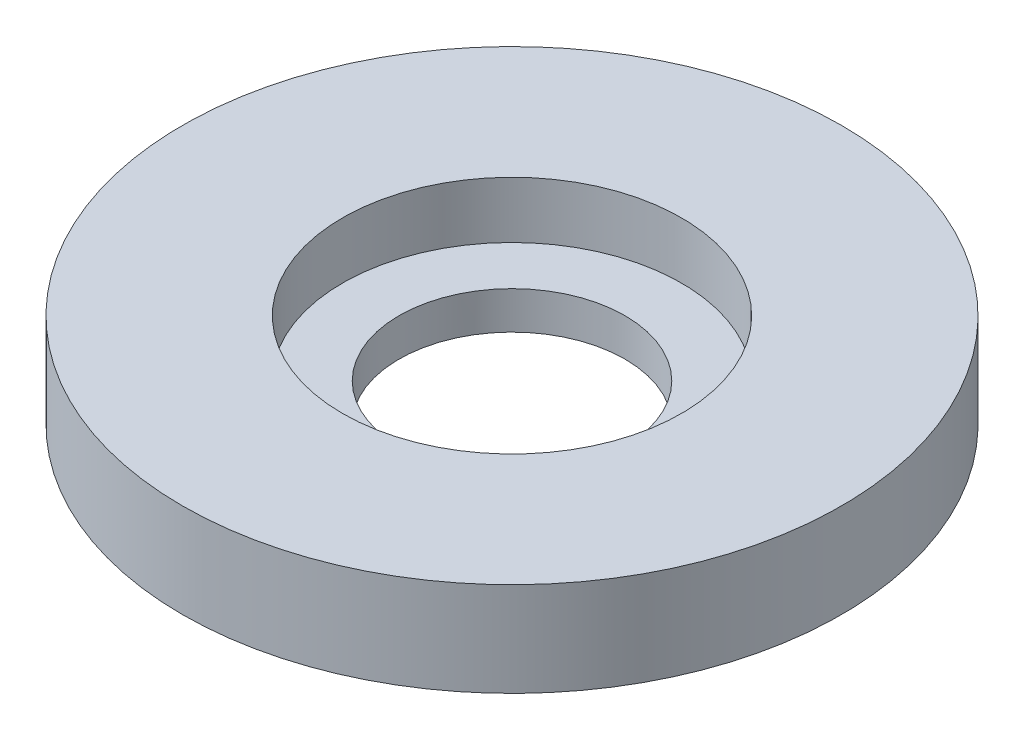
ISO-10303-21;
HEADER;
FILE_DESCRIPTION(('STEP AP214'),'2;1');
FILE_NAME('part.step','',(''),(''),'','','');
FILE_SCHEMA(('AUTOMOTIVE_DESIGN { 1 0 10303 214 1 1 1 1 }'));
ENDSEC;
DATA;
#1=APPLICATION_CONTEXT('core data for automotive mechanical design processes');
#2=APPLICATION_PROTOCOL_DEFINITION('international standard','automotive_design',2000,#1);
#3=PRODUCT_CONTEXT('',#1,'mechanical');
#4=PRODUCT('Part','Part','',(#3));
#5=PRODUCT_RELATED_PRODUCT_CATEGORY('part','',(#4));
#6=PRODUCT_DEFINITION_FORMATION('','',#4);
#7=PRODUCT_DEFINITION_CONTEXT('part definition',#1,'design');
#8=PRODUCT_DEFINITION('design','',#6,#7);
#9=PRODUCT_DEFINITION_SHAPE('','',#8);
#10=(LENGTH_UNIT() NAMED_UNIT(*) SI_UNIT(.MILLI.,.METRE.));
#11=(NAMED_UNIT(*) PLANE_ANGLE_UNIT() SI_UNIT($,.RADIAN.));
#12=(NAMED_UNIT(*) SI_UNIT($,.STERADIAN.) SOLID_ANGLE_UNIT());
#13=UNCERTAINTY_MEASURE_WITH_UNIT(LENGTH_MEASURE(1.E-05),#10,'distance_accuracy_value','');
#14=(GEOMETRIC_REPRESENTATION_CONTEXT(3) GLOBAL_UNCERTAINTY_ASSIGNED_CONTEXT((#13)) GLOBAL_UNIT_ASSIGNED_CONTEXT((#10,
#11,#12)) REPRESENTATION_CONTEXT('',''));
#15=CARTESIAN_POINT('',(0.,0.,0.));
#16=DIRECTION('',(0.,0.,1.));
#17=DIRECTION('',(1.,0.,0.));
#18=AXIS2_PLACEMENT_3D('',#15,#16,#17);
#19=CARTESIAN_POINT('',(0.,500.,0.));
#20=DIRECTION('',(0.,-1.,0.));
#21=DIRECTION('',(0.,0.,-1.));
#22=AXIS2_PLACEMENT_3D('',#19,#20,#21);
#23=CYLINDRICAL_SURFACE('',#22,1750.);
#24=CARTESIAN_POINT('',(0.,500.,0.));
#25=DIRECTION('',(0.,1.,0.));
#26=DIRECTION('',(0.,0.,1.));
#27=AXIS2_PLACEMENT_3D('',#24,#25,#26);
#28=CIRCLE('',#27,1750.);
#29=CARTESIAN_POINT('',(0.,500.,1750.));
#30=VERTEX_POINT('',#29);
#31=EDGE_CURVE('E10',#30,#30,#28,.T.);
#32=ORIENTED_EDGE('',*,*,#31,.F.);
#33=EDGE_LOOP('',(#32));
#34=FACE_BOUND('',#33,.T.);
#35=CARTESIAN_POINT('',(0.,0.,0.));
#36=DIRECTION('',(0.,1.,0.));
#37=DIRECTION('',(0.,0.,1.));
#38=AXIS2_PLACEMENT_3D('',#35,#36,#37);
#39=CIRCLE('',#38,1750.);
#40=CARTESIAN_POINT('',(0.,0.,1750.));
#41=VERTEX_POINT('',#40);
#42=EDGE_CURVE('E45',#41,#41,#39,.T.);
#43=ORIENTED_EDGE('',*,*,#42,.T.);
#44=EDGE_LOOP('',(#43));
#45=FACE_BOUND('',#44,.T.);
#46=ADVANCED_FACE('F37',(#34,#45),#23,.T.);
#47=CARTESIAN_POINT('',(0.,500.,0.));
#48=DIRECTION('',(0.,1.,0.));
#49=DIRECTION('',(0.,0.,1.));
#50=AXIS2_PLACEMENT_3D('',#47,#48,#49);
#51=PLANE('',#50);
#52=CARTESIAN_POINT('',(0.,500.,0.));
#53=DIRECTION('',(0.,1.,0.));
#54=DIRECTION('',(0.,0.,1.));
#55=AXIS2_PLACEMENT_3D('',#52,#53,#54);
#56=CIRCLE('',#55,900.);
#57=CARTESIAN_POINT('',(0.,500.,900.));
#58=VERTEX_POINT('',#57);
#59=EDGE_CURVE('E53',#58,#58,#56,.T.);
#60=ORIENTED_EDGE('',*,*,#59,.F.);
#61=EDGE_LOOP('',(#60));
#62=FACE_BOUND('',#61,.T.);
#63=ORIENTED_EDGE('',*,*,#31,.T.);
#64=EDGE_LOOP('',(#63));
#65=FACE_BOUND('',#64,.T.);
#66=ADVANCED_FACE('F84',(#62,#65),#51,.T.);
#67=CARTESIAN_POINT('',(0.,0.,0.));
#68=DIRECTION('',(0.,1.,0.));
#69=DIRECTION('',(0.,0.,1.));
#70=AXIS2_PLACEMENT_3D('',#67,#68,#69);
#71=PLANE('',#70);
#72=CARTESIAN_POINT('',(0.,0.,0.));
#73=DIRECTION('',(0.,-1.,0.));
#74=DIRECTION('',(0.,0.,-1.));
#75=AXIS2_PLACEMENT_3D('',#72,#73,#74);
#76=CIRCLE('',#75,600.);
#77=CARTESIAN_POINT('',(0.,0.,-600.));
#78=VERTEX_POINT('',#77);
#79=EDGE_CURVE('E60',#78,#78,#76,.T.);
#80=ORIENTED_EDGE('',*,*,#79,.F.);
#81=EDGE_LOOP('',(#80));
#82=FACE_BOUND('',#81,.T.);
#83=ORIENTED_EDGE('',*,*,#42,.F.);
#84=EDGE_LOOP('',(#83));
#85=FACE_BOUND('',#84,.T.);
#86=ADVANCED_FACE('F80',(#82,#85),#71,.F.);
#87=CARTESIAN_POINT('',(0.,200.,0.));
#88=DIRECTION('',(0.,1.,0.));
#89=DIRECTION('',(0.,0.,1.));
#90=AXIS2_PLACEMENT_3D('',#87,#88,#89);
#91=CYLINDRICAL_SURFACE('',#90,900.);
#92=CARTESIAN_POINT('',(0.,200.,0.));
#93=DIRECTION('',(0.,1.,0.));
#94=DIRECTION('',(0.,0.,1.));
#95=AXIS2_PLACEMENT_3D('',#92,#93,#94);
#96=CIRCLE('',#95,900.);
#97=CARTESIAN_POINT('',(0.,200.,900.));
#98=VERTEX_POINT('',#97);
#99=EDGE_CURVE('E51',#98,#98,#96,.T.);
#100=ORIENTED_EDGE('',*,*,#99,.F.);
#101=EDGE_LOOP('',(#100));
#102=FACE_BOUND('',#101,.T.);
#103=ORIENTED_EDGE('',*,*,#59,.T.);
#104=EDGE_LOOP('',(#103));
#105=FACE_BOUND('',#104,.T.);
#106=ADVANCED_FACE('F74',(#102,#105),#91,.F.);
#107=CARTESIAN_POINT('',(0.,200.,0.));
#108=DIRECTION('',(0.,1.,0.));
#109=DIRECTION('',(0.,0.,1.));
#110=AXIS2_PLACEMENT_3D('',#107,#108,#109);
#111=PLANE('',#110);
#112=CARTESIAN_POINT('',(0.,200.,0.));
#113=DIRECTION('',(0.,1.,0.));
#114=DIRECTION('',(0.,0.,1.));
#115=AXIS2_PLACEMENT_3D('',#112,#113,#114);
#116=CIRCLE('',#115,600.);
#117=CARTESIAN_POINT('',(0.,200.,600.));
#118=VERTEX_POINT('',#117);
#119=EDGE_CURVE('E40',#118,#118,#116,.T.);
#120=ORIENTED_EDGE('',*,*,#119,.F.);
#121=EDGE_LOOP('',(#120));
#122=FACE_BOUND('',#121,.T.);
#123=ORIENTED_EDGE('',*,*,#99,.T.);
#124=EDGE_LOOP('',(#123));
#125=FACE_BOUND('',#124,.T.);
#126=ADVANCED_FACE('F71',(#122,#125),#111,.T.);
#127=CARTESIAN_POINT('',(0.,300.,0.));
#128=DIRECTION('',(0.,-1.,0.));
#129=DIRECTION('',(0.,0.,-1.));
#130=AXIS2_PLACEMENT_3D('',#127,#128,#129);
#131=CYLINDRICAL_SURFACE('',#130,600.);
#132=ORIENTED_EDGE('',*,*,#119,.T.);
#133=EDGE_LOOP('',(#132));
#134=FACE_BOUND('',#133,.T.);
#135=ORIENTED_EDGE('',*,*,#79,.T.);
#136=EDGE_LOOP('',(#135));
#137=FACE_BOUND('',#136,.T.);
#138=ADVANCED_FACE('F69',(#134,#137),#131,.F.);
#139=CLOSED_SHELL('',(#46,#66,#86,#106,#126,#138));
#140=MANIFOLD_SOLID_BREP('B2',#139);
#141=ADVANCED_BREP_SHAPE_REPRESENTATION('',(#18,#140),#14);
#142=SHAPE_DEFINITION_REPRESENTATION(#9,#141);
ENDSEC;
END-ISO-10303-21;
